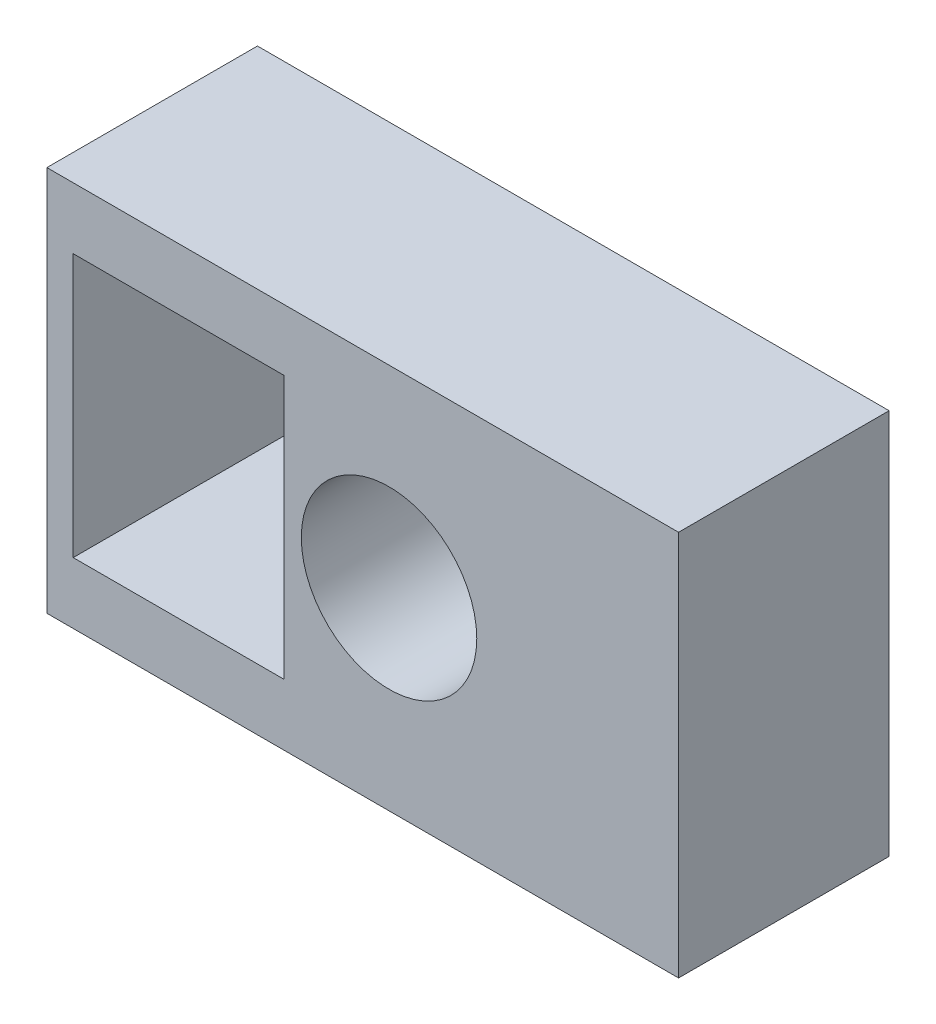
ISO-10303-21;
HEADER;
FILE_DESCRIPTION(('STEP AP214'),'2;1');
FILE_NAME('part.step','',(''),(''),'','','');
FILE_SCHEMA(('AUTOMOTIVE_DESIGN { 1 0 10303 214 1 1 1 1 }'));
ENDSEC;
DATA;
#1=APPLICATION_CONTEXT('core data for automotive mechanical design processes');
#2=APPLICATION_PROTOCOL_DEFINITION('international standard','automotive_design',2000,#1);
#3=PRODUCT_CONTEXT('',#1,'mechanical');
#4=PRODUCT('Part','Part','',(#3));
#5=PRODUCT_RELATED_PRODUCT_CATEGORY('part','',(#4));
#6=PRODUCT_DEFINITION_FORMATION('','',#4);
#7=PRODUCT_DEFINITION_CONTEXT('part definition',#1,'design');
#8=PRODUCT_DEFINITION('design','',#6,#7);
#9=PRODUCT_DEFINITION_SHAPE('','',#8);
#10=(LENGTH_UNIT() NAMED_UNIT(*) SI_UNIT(.MILLI.,.METRE.));
#11=(NAMED_UNIT(*) PLANE_ANGLE_UNIT() SI_UNIT($,.RADIAN.));
#12=(NAMED_UNIT(*) SI_UNIT($,.STERADIAN.) SOLID_ANGLE_UNIT());
#13=UNCERTAINTY_MEASURE_WITH_UNIT(LENGTH_MEASURE(1.E-05),#10,'distance_accuracy_value','');
#14=(GEOMETRIC_REPRESENTATION_CONTEXT(3) GLOBAL_UNCERTAINTY_ASSIGNED_CONTEXT((#13)) GLOBAL_UNIT_ASSIGNED_CONTEXT((#10,
#11,#12)) REPRESENTATION_CONTEXT('',''));
#15=CARTESIAN_POINT('',(0.,0.,0.));
#16=DIRECTION('',(0.,0.,1.));
#17=DIRECTION('',(1.,0.,0.));
#18=AXIS2_PLACEMENT_3D('',#15,#16,#17);
#19=CARTESIAN_POINT('',(0.,0.,6.));
#20=DIRECTION('',(0.,0.,1.));
#21=DIRECTION('',(1.,0.,0.));
#22=AXIS2_PLACEMENT_3D('',#19,#20,#21);
#23=PLANE('',#22);
#24=DIRECTION('',(1.,0.,0.));
#25=VECTOR('',#24,1.);
#26=CARTESIAN_POINT('',(0.,0.,6.));
#27=LINE('',#26,#25);
#28=CARTESIAN_POINT('',(0.,0.,6.));
#29=VERTEX_POINT('',#28);
#30=CARTESIAN_POINT('',(6.,0.,6.));
#31=VERTEX_POINT('',#30);
#32=EDGE_CURVE('E138',#29,#31,#27,.T.);
#33=ORIENTED_EDGE('',*,*,#32,.F.);
#34=DIRECTION('',(0.,-1.,0.));
#35=VECTOR('',#34,1.);
#36=CARTESIAN_POINT('',(0.,0.,6.));
#37=LINE('',#36,#35);
#38=CARTESIAN_POINT('',(0.,7.5,6.));
#39=VERTEX_POINT('',#38);
#40=EDGE_CURVE('E136',#39,#29,#37,.T.);
#41=ORIENTED_EDGE('',*,*,#40,.F.);
#42=DIRECTION('',(-1.,0.,0.));
#43=VECTOR('',#42,1.);
#44=CARTESIAN_POINT('',(0.,7.5,6.));
#45=LINE('',#44,#43);
#46=CARTESIAN_POINT('',(6.,7.5,6.));
#47=VERTEX_POINT('',#46);
#48=EDGE_CURVE('E143',#47,#39,#45,.T.);
#49=ORIENTED_EDGE('',*,*,#48,.F.);
#50=DIRECTION('',(0.,1.,0.));
#51=VECTOR('',#50,1.);
#52=CARTESIAN_POINT('',(6.,0.,6.));
#53=LINE('',#52,#51);
#54=EDGE_CURVE('E141',#31,#47,#53,.T.);
#55=ORIENTED_EDGE('',*,*,#54,.F.);
#56=EDGE_LOOP('',(#33,#41,#49,#55));
#57=FACE_BOUND('',#56,.T.);
#58=DIRECTION('',(0.,-1.,0.));
#59=VECTOR('',#58,1.);
#60=CARTESIAN_POINT('',(-0.75,9.25,6.));
#61=LINE('',#60,#59);
#62=CARTESIAN_POINT('',(-0.75,9.25,6.));
#63=VERTEX_POINT('',#62);
#64=CARTESIAN_POINT('',(-0.749999999999999,-1.75,6.));
#65=VERTEX_POINT('',#64);
#66=EDGE_CURVE('E108',#63,#65,#61,.T.);
#67=ORIENTED_EDGE('',*,*,#66,.T.);
#68=DIRECTION('',(1.,0.,0.));
#69=VECTOR('',#68,1.);
#70=CARTESIAN_POINT('',(-0.749999999999999,-1.75,6.));
#71=LINE('',#70,#69);
#72=CARTESIAN_POINT('',(17.25,-1.75,6.));
#73=VERTEX_POINT('',#72);
#74=EDGE_CURVE('E102',#65,#73,#71,.T.);
#75=ORIENTED_EDGE('',*,*,#74,.T.);
#76=DIRECTION('',(0.,-1.,0.));
#77=VECTOR('',#76,1.);
#78=CARTESIAN_POINT('',(17.25,9.25,6.));
#79=LINE('',#78,#77);
#80=CARTESIAN_POINT('',(17.25,9.25,6.));
#81=VERTEX_POINT('',#80);
#82=EDGE_CURVE('E106',#81,#73,#79,.T.);
#83=ORIENTED_EDGE('',*,*,#82,.F.);
#84=DIRECTION('',(-1.,0.,0.));
#85=VECTOR('',#84,1.);
#86=CARTESIAN_POINT('',(-0.75,9.25,6.));
#87=LINE('',#86,#85);
#88=EDGE_CURVE('E111',#81,#63,#87,.T.);
#89=ORIENTED_EDGE('',*,*,#88,.T.);
#90=EDGE_LOOP('',(#67,#75,#83,#89));
#91=FACE_BOUND('',#90,.T.);
#92=CARTESIAN_POINT('',(9.,3.75,6.));
#93=DIRECTION('',(0.,0.,1.));
#94=DIRECTION('',(1.,0.,0.));
#95=AXIS2_PLACEMENT_3D('',#92,#93,#94);
#96=CIRCLE('',#95,2.5);
#97=CARTESIAN_POINT('',(11.5,3.75,6.));
#98=VERTEX_POINT('',#97);
#99=EDGE_CURVE('E131',#98,#98,#96,.T.);
#100=ORIENTED_EDGE('',*,*,#99,.F.);
#101=EDGE_LOOP('',(#100));
#102=FACE_BOUND('',#101,.T.);
#103=ADVANCED_FACE('F35',(#57,#91,#102),#23,.T.);
#104=CARTESIAN_POINT('',(0.,0.,0.));
#105=DIRECTION('',(0.,0.,1.));
#106=DIRECTION('',(1.,0.,0.));
#107=AXIS2_PLACEMENT_3D('',#104,#105,#106);
#108=PLANE('',#107);
#109=DIRECTION('',(0.,-1.,0.));
#110=VECTOR('',#109,1.);
#111=CARTESIAN_POINT('',(0.,0.,0.));
#112=LINE('',#111,#110);
#113=CARTESIAN_POINT('',(0.,7.5,0.));
#114=VERTEX_POINT('',#113);
#115=CARTESIAN_POINT('',(0.,0.,0.));
#116=VERTEX_POINT('',#115);
#117=EDGE_CURVE('E58',#114,#116,#112,.T.);
#118=ORIENTED_EDGE('',*,*,#117,.T.);
#119=DIRECTION('',(1.,0.,0.));
#120=VECTOR('',#119,1.);
#121=CARTESIAN_POINT('',(0.,0.,0.));
#122=LINE('',#121,#120);
#123=CARTESIAN_POINT('',(6.,0.,0.));
#124=VERTEX_POINT('',#123);
#125=EDGE_CURVE('E147',#116,#124,#122,.T.);
#126=ORIENTED_EDGE('',*,*,#125,.T.);
#127=DIRECTION('',(0.,1.,0.));
#128=VECTOR('',#127,1.);
#129=CARTESIAN_POINT('',(6.,0.,0.));
#130=LINE('',#129,#128);
#131=CARTESIAN_POINT('',(6.,7.5,0.));
#132=VERTEX_POINT('',#131);
#133=EDGE_CURVE('E150',#124,#132,#130,.T.);
#134=ORIENTED_EDGE('',*,*,#133,.T.);
#135=DIRECTION('',(-1.,0.,0.));
#136=VECTOR('',#135,1.);
#137=CARTESIAN_POINT('',(0.,7.5,0.));
#138=LINE('',#137,#136);
#139=EDGE_CURVE('E139',#132,#114,#138,.T.);
#140=ORIENTED_EDGE('',*,*,#139,.T.);
#141=EDGE_LOOP('',(#118,#126,#134,#140));
#142=FACE_BOUND('',#141,.T.);
#143=DIRECTION('',(0.,-1.,0.));
#144=VECTOR('',#143,1.);
#145=CARTESIAN_POINT('',(-0.75,9.25,0.));
#146=LINE('',#145,#144);
#147=CARTESIAN_POINT('',(-0.75,9.25,0.));
#148=VERTEX_POINT('',#147);
#149=CARTESIAN_POINT('',(-0.749999999999999,-1.75,0.));
#150=VERTEX_POINT('',#149);
#151=EDGE_CURVE('E161',#148,#150,#146,.T.);
#152=ORIENTED_EDGE('',*,*,#151,.F.);
#153=DIRECTION('',(-1.,0.,0.));
#154=VECTOR('',#153,1.);
#155=CARTESIAN_POINT('',(-0.75,9.25,0.));
#156=LINE('',#155,#154);
#157=CARTESIAN_POINT('',(17.25,9.25,0.));
#158=VERTEX_POINT('',#157);
#159=EDGE_CURVE('E162',#158,#148,#156,.T.);
#160=ORIENTED_EDGE('',*,*,#159,.F.);
#161=DIRECTION('',(0.,1.,0.));
#162=VECTOR('',#161,1.);
#163=CARTESIAN_POINT('',(17.25,9.25,0.));
#164=LINE('',#163,#162);
#165=CARTESIAN_POINT('',(17.25,-1.75,0.));
#166=VERTEX_POINT('',#165);
#167=EDGE_CURVE('E120',#166,#158,#164,.T.);
#168=ORIENTED_EDGE('',*,*,#167,.F.);
#169=DIRECTION('',(1.,0.,0.));
#170=VECTOR('',#169,1.);
#171=CARTESIAN_POINT('',(-0.749999999999999,-1.75,0.));
#172=LINE('',#171,#170);
#173=EDGE_CURVE('E116',#150,#166,#172,.T.);
#174=ORIENTED_EDGE('',*,*,#173,.F.);
#175=EDGE_LOOP('',(#152,#160,#168,#174));
#176=FACE_BOUND('',#175,.T.);
#177=CARTESIAN_POINT('',(9.,3.75,0.));
#178=DIRECTION('',(0.,0.,1.));
#179=DIRECTION('',(1.,0.,0.));
#180=AXIS2_PLACEMENT_3D('',#177,#178,#179);
#181=CIRCLE('',#180,2.5);
#182=CARTESIAN_POINT('',(11.5,3.75,0.));
#183=VERTEX_POINT('',#182);
#184=EDGE_CURVE('E130',#183,#183,#181,.T.);
#185=ORIENTED_EDGE('',*,*,#184,.T.);
#186=EDGE_LOOP('',(#185));
#187=FACE_BOUND('',#186,.T.);
#188=ADVANCED_FACE('F174',(#142,#176,#187),#108,.F.);
#189=CARTESIAN_POINT('',(-0.75,9.25,6.));
#190=DIRECTION('',(1.,0.,0.));
#191=DIRECTION('',(0.,1.,0.));
#192=AXIS2_PLACEMENT_3D('',#189,#190,#191);
#193=PLANE('',#192);
#194=ORIENTED_EDGE('',*,*,#151,.T.);
#195=DIRECTION('',(0.,0.,-1.));
#196=VECTOR('',#195,1.);
#197=CARTESIAN_POINT('',(-0.749999999999999,-1.75,6.));
#198=LINE('',#197,#196);
#199=EDGE_CURVE('E11',#65,#150,#198,.T.);
#200=ORIENTED_EDGE('',*,*,#199,.F.);
#201=ORIENTED_EDGE('',*,*,#66,.F.);
#202=DIRECTION('',(0.,0.,-1.));
#203=VECTOR('',#202,1.);
#204=CARTESIAN_POINT('',(-0.75,9.25,6.));
#205=LINE('',#204,#203);
#206=EDGE_CURVE('E43',#63,#148,#205,.T.);
#207=ORIENTED_EDGE('',*,*,#206,.T.);
#208=EDGE_LOOP('',(#194,#200,#201,#207));
#209=FACE_BOUND('',#208,.T.);
#210=ADVANCED_FACE('F37',(#209),#193,.F.);
#211=CARTESIAN_POINT('',(-0.749999999999999,-1.75,6.));
#212=DIRECTION('',(0.,1.,0.));
#213=DIRECTION('',(-1.,0.,0.));
#214=AXIS2_PLACEMENT_3D('',#211,#212,#213);
#215=PLANE('',#214);
#216=ORIENTED_EDGE('',*,*,#173,.T.);
#217=DIRECTION('',(0.,0.,-1.));
#218=VECTOR('',#217,1.);
#219=CARTESIAN_POINT('',(17.25,-1.75,6.));
#220=LINE('',#219,#218);
#221=EDGE_CURVE('E114',#73,#166,#220,.T.);
#222=ORIENTED_EDGE('',*,*,#221,.F.);
#223=ORIENTED_EDGE('',*,*,#74,.F.);
#224=ORIENTED_EDGE('',*,*,#199,.T.);
#225=EDGE_LOOP('',(#216,#222,#223,#224));
#226=FACE_BOUND('',#225,.T.);
#227=ADVANCED_FACE('F115',(#226),#215,.F.);
#228=CARTESIAN_POINT('',(-0.75,9.25,6.));
#229=DIRECTION('',(0.,-1.,0.));
#230=DIRECTION('',(1.,0.,0.));
#231=AXIS2_PLACEMENT_3D('',#228,#229,#230);
#232=PLANE('',#231);
#233=ORIENTED_EDGE('',*,*,#159,.T.);
#234=ORIENTED_EDGE('',*,*,#206,.F.);
#235=ORIENTED_EDGE('',*,*,#88,.F.);
#236=DIRECTION('',(0.,0.,1.));
#237=VECTOR('',#236,1.);
#238=CARTESIAN_POINT('',(17.25,9.25,6.));
#239=LINE('',#238,#237);
#240=EDGE_CURVE('E125',#158,#81,#239,.T.);
#241=ORIENTED_EDGE('',*,*,#240,.F.);
#242=EDGE_LOOP('',(#233,#234,#235,#241));
#243=FACE_BOUND('',#242,.T.);
#244=ADVANCED_FACE('F176',(#243),#232,.F.);
#245=CARTESIAN_POINT('',(0.,0.,6.));
#246=DIRECTION('',(1.,0.,0.));
#247=DIRECTION('',(0.,0.,-1.));
#248=AXIS2_PLACEMENT_3D('',#245,#246,#247);
#249=PLANE('',#248);
#250=ORIENTED_EDGE('',*,*,#117,.F.);
#251=DIRECTION('',(0.,0.,-1.));
#252=VECTOR('',#251,1.);
#253=CARTESIAN_POINT('',(0.,7.5,6.));
#254=LINE('',#253,#252);
#255=EDGE_CURVE('E145',#39,#114,#254,.T.);
#256=ORIENTED_EDGE('',*,*,#255,.F.);
#257=ORIENTED_EDGE('',*,*,#40,.T.);
#258=DIRECTION('',(0.,0.,-1.));
#259=VECTOR('',#258,1.);
#260=CARTESIAN_POINT('',(0.,0.,6.));
#261=LINE('',#260,#259);
#262=EDGE_CURVE('E159',#29,#116,#261,.T.);
#263=ORIENTED_EDGE('',*,*,#262,.T.);
#264=EDGE_LOOP('',(#250,#256,#257,#263));
#265=FACE_BOUND('',#264,.T.);
#266=ADVANCED_FACE('F178',(#265),#249,.T.);
#267=CARTESIAN_POINT('',(0.,0.,6.));
#268=DIRECTION('',(0.,1.,0.));
#269=DIRECTION('',(0.,0.,1.));
#270=AXIS2_PLACEMENT_3D('',#267,#268,#269);
#271=PLANE('',#270);
#272=ORIENTED_EDGE('',*,*,#125,.F.);
#273=ORIENTED_EDGE('',*,*,#262,.F.);
#274=ORIENTED_EDGE('',*,*,#32,.T.);
#275=DIRECTION('',(0.,0.,-1.));
#276=VECTOR('',#275,1.);
#277=CARTESIAN_POINT('',(6.,0.,6.));
#278=LINE('',#277,#276);
#279=EDGE_CURVE('E157',#31,#124,#278,.T.);
#280=ORIENTED_EDGE('',*,*,#279,.T.);
#281=EDGE_LOOP('',(#272,#273,#274,#280));
#282=FACE_BOUND('',#281,.T.);
#283=ADVANCED_FACE('F184',(#282),#271,.T.);
#284=CARTESIAN_POINT('',(6.,0.,6.));
#285=DIRECTION('',(-1.,0.,0.));
#286=DIRECTION('',(0.,0.,1.));
#287=AXIS2_PLACEMENT_3D('',#284,#285,#286);
#288=PLANE('',#287);
#289=ORIENTED_EDGE('',*,*,#133,.F.);
#290=ORIENTED_EDGE('',*,*,#279,.F.);
#291=ORIENTED_EDGE('',*,*,#54,.T.);
#292=DIRECTION('',(0.,0.,-1.));
#293=VECTOR('',#292,1.);
#294=CARTESIAN_POINT('',(6.,7.5,6.));
#295=LINE('',#294,#293);
#296=EDGE_CURVE('E50',#47,#132,#295,.T.);
#297=ORIENTED_EDGE('',*,*,#296,.T.);
#298=EDGE_LOOP('',(#289,#290,#291,#297));
#299=FACE_BOUND('',#298,.T.);
#300=ADVANCED_FACE('F198',(#299),#288,.T.);
#301=CARTESIAN_POINT('',(0.,7.5,6.));
#302=DIRECTION('',(0.,-1.,0.));
#303=DIRECTION('',(0.,0.,-1.));
#304=AXIS2_PLACEMENT_3D('',#301,#302,#303);
#305=PLANE('',#304);
#306=ORIENTED_EDGE('',*,*,#139,.F.);
#307=ORIENTED_EDGE('',*,*,#296,.F.);
#308=ORIENTED_EDGE('',*,*,#48,.T.);
#309=ORIENTED_EDGE('',*,*,#255,.T.);
#310=EDGE_LOOP('',(#306,#307,#308,#309));
#311=FACE_BOUND('',#310,.T.);
#312=ADVANCED_FACE('F202',(#311),#305,.T.);
#313=CARTESIAN_POINT('',(9.,3.75,6.));
#314=DIRECTION('',(0.,0.,-1.));
#315=DIRECTION('',(-1.,0.,0.));
#316=AXIS2_PLACEMENT_3D('',#313,#314,#315);
#317=CYLINDRICAL_SURFACE('',#316,2.5);
#318=ORIENTED_EDGE('',*,*,#99,.T.);
#319=EDGE_LOOP('',(#318));
#320=FACE_BOUND('',#319,.T.);
#321=ORIENTED_EDGE('',*,*,#184,.F.);
#322=EDGE_LOOP('',(#321));
#323=FACE_BOUND('',#322,.T.);
#324=ADVANCED_FACE('F206',(#320,#323),#317,.F.);
#325=CARTESIAN_POINT('',(17.25,0.,0.));
#326=DIRECTION('',(1.,0.,0.));
#327=DIRECTION('',(0.,0.,-1.));
#328=AXIS2_PLACEMENT_3D('',#325,#326,#327);
#329=PLANE('',#328);
#330=ORIENTED_EDGE('',*,*,#82,.T.);
#331=ORIENTED_EDGE('',*,*,#221,.T.);
#332=ORIENTED_EDGE('',*,*,#167,.T.);
#333=ORIENTED_EDGE('',*,*,#240,.T.);
#334=EDGE_LOOP('',(#330,#331,#332,#333));
#335=FACE_BOUND('',#334,.T.);
#336=ADVANCED_FACE('F123',(#335),#329,.T.);
#337=CLOSED_SHELL('',(#103,#188,#210,#227,#244,#266,#283,#300,#312,#324,#336));
#338=MANIFOLD_SOLID_BREP('B2',#337);
#339=ADVANCED_BREP_SHAPE_REPRESENTATION('',(#18,#338),#14);
#340=SHAPE_DEFINITION_REPRESENTATION(#9,#339);
ENDSEC;
END-ISO-10303-21;
